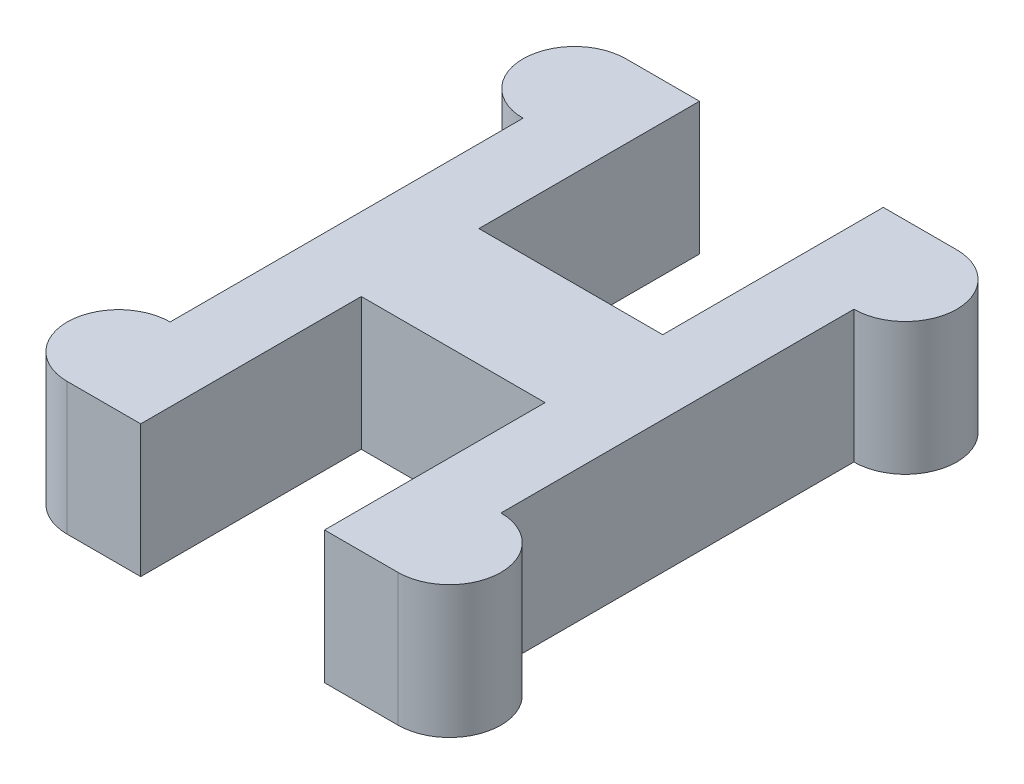
ISO-10303-21;
HEADER;
FILE_DESCRIPTION(('STEP AP214'),'2;1');
FILE_NAME('part.step','',(''),(''),'','','');
FILE_SCHEMA(('AUTOMOTIVE_DESIGN { 1 0 10303 214 1 1 1 1 }'));
ENDSEC;
DATA;
#1=APPLICATION_CONTEXT('core data for automotive mechanical design processes');
#2=APPLICATION_PROTOCOL_DEFINITION('international standard','automotive_design',2000,#1);
#3=PRODUCT_CONTEXT('',#1,'mechanical');
#4=PRODUCT('Part','Part','',(#3));
#5=PRODUCT_RELATED_PRODUCT_CATEGORY('part','',(#4));
#6=PRODUCT_DEFINITION_FORMATION('','',#4);
#7=PRODUCT_DEFINITION_CONTEXT('part definition',#1,'design');
#8=PRODUCT_DEFINITION('design','',#6,#7);
#9=PRODUCT_DEFINITION_SHAPE('','',#8);
#10=(LENGTH_UNIT() NAMED_UNIT(*) SI_UNIT(.MILLI.,.METRE.));
#11=(NAMED_UNIT(*) PLANE_ANGLE_UNIT() SI_UNIT($,.RADIAN.));
#12=(NAMED_UNIT(*) SI_UNIT($,.STERADIAN.) SOLID_ANGLE_UNIT());
#13=UNCERTAINTY_MEASURE_WITH_UNIT(LENGTH_MEASURE(1.E-05),#10,'distance_accuracy_value','');
#14=(GEOMETRIC_REPRESENTATION_CONTEXT(3) GLOBAL_UNCERTAINTY_ASSIGNED_CONTEXT((#13)) GLOBAL_UNIT_ASSIGNED_CONTEXT((#10,
#11,#12)) REPRESENTATION_CONTEXT('',''));
#15=CARTESIAN_POINT('',(0.,0.,0.));
#16=DIRECTION('',(0.,0.,1.));
#17=DIRECTION('',(1.,0.,0.));
#18=AXIS2_PLACEMENT_3D('',#15,#16,#17);
#19=CARTESIAN_POINT('',(-2.25,1.8,0.));
#20=DIRECTION('',(-1.,0.,0.));
#21=DIRECTION('',(0.,0.,1.));
#22=AXIS2_PLACEMENT_3D('',#19,#20,#21);
#23=PLANE('',#22);
#24=DIRECTION('',(0.,0.,-1.));
#25=VECTOR('',#24,1.);
#26=CARTESIAN_POINT('',(-2.25,0.,0.));
#27=LINE('',#26,#25);
#28=CARTESIAN_POINT('',(-2.25,0.,2.4));
#29=VERTEX_POINT('',#28);
#30=CARTESIAN_POINT('',(-2.25,0.,-2.4));
#31=VERTEX_POINT('',#30);
#32=EDGE_CURVE('E182',#29,#31,#27,.T.);
#33=ORIENTED_EDGE('',*,*,#32,.F.);
#34=DIRECTION('',(0.,-1.,0.));
#35=VECTOR('',#34,1.);
#36=CARTESIAN_POINT('',(-2.25,1.8,2.4));
#37=LINE('',#36,#35);
#38=CARTESIAN_POINT('',(-2.25,1.8,2.4));
#39=VERTEX_POINT('',#38);
#40=EDGE_CURVE('E11',#39,#29,#37,.T.);
#41=ORIENTED_EDGE('',*,*,#40,.F.);
#42=DIRECTION('',(0.,0.,-1.));
#43=VECTOR('',#42,1.);
#44=CARTESIAN_POINT('',(-2.25,1.8,0.));
#45=LINE('',#44,#43);
#46=CARTESIAN_POINT('',(-2.25,1.8,-2.4));
#47=VERTEX_POINT('',#46);
#48=EDGE_CURVE('E221',#39,#47,#45,.T.);
#49=ORIENTED_EDGE('',*,*,#48,.T.);
#50=DIRECTION('',(0.,-1.,0.));
#51=VECTOR('',#50,1.);
#52=CARTESIAN_POINT('',(-2.25,1.8,-2.4));
#53=LINE('',#52,#51);
#54=EDGE_CURVE('E115',#47,#31,#53,.T.);
#55=ORIENTED_EDGE('',*,*,#54,.T.);
#56=EDGE_LOOP('',(#33,#41,#49,#55));
#57=FACE_BOUND('',#56,.T.);
#58=ADVANCED_FACE('F41',(#57),#23,.T.);
#59=CARTESIAN_POINT('',(-2.25,1.8,3.1));
#60=DIRECTION('',(0.,-1.,0.));
#61=DIRECTION('',(0.,0.,-1.));
#62=AXIS2_PLACEMENT_3D('',#59,#60,#61);
#63=CYLINDRICAL_SURFACE('',#62,0.7);
#64=CARTESIAN_POINT('',(-2.25,0.,3.1));
#65=DIRECTION('',(0.,1.,0.));
#66=DIRECTION('',(0.,0.,1.));
#67=AXIS2_PLACEMENT_3D('',#64,#65,#66);
#68=CIRCLE('',#67,0.7);
#69=CARTESIAN_POINT('',(-2.25,0.,3.8));
#70=VERTEX_POINT('',#69);
#71=EDGE_CURVE('E185',#29,#70,#68,.T.);
#72=ORIENTED_EDGE('',*,*,#71,.T.);
#73=DIRECTION('',(0.,-1.,0.));
#74=VECTOR('',#73,1.);
#75=CARTESIAN_POINT('',(-2.25,1.8,3.8));
#76=LINE('',#75,#74);
#77=CARTESIAN_POINT('',(-2.25,1.8,3.8));
#78=VERTEX_POINT('',#77);
#79=EDGE_CURVE('E49',#78,#70,#76,.T.);
#80=ORIENTED_EDGE('',*,*,#79,.F.);
#81=CARTESIAN_POINT('',(-2.25,1.8,3.1));
#82=DIRECTION('',(0.,1.,0.));
#83=DIRECTION('',(0.,0.,1.));
#84=AXIS2_PLACEMENT_3D('',#81,#82,#83);
#85=CIRCLE('',#84,0.7);
#86=EDGE_CURVE('E273',#39,#78,#85,.T.);
#87=ORIENTED_EDGE('',*,*,#86,.F.);
#88=ORIENTED_EDGE('',*,*,#40,.T.);
#89=EDGE_LOOP('',(#72,#80,#87,#88));
#90=FACE_BOUND('',#89,.T.);
#91=ADVANCED_FACE('F298',(#90),#63,.T.);
#92=CARTESIAN_POINT('',(0.,1.8,3.8));
#93=DIRECTION('',(0.,0.,-1.));
#94=DIRECTION('',(-1.,0.,0.));
#95=AXIS2_PLACEMENT_3D('',#92,#93,#94);
#96=PLANE('',#95);
#97=DIRECTION('',(1.,0.,0.));
#98=VECTOR('',#97,1.);
#99=CARTESIAN_POINT('',(0.,0.,3.8));
#100=LINE('',#99,#98);
#101=CARTESIAN_POINT('',(-1.25,0.,3.8));
#102=VERTEX_POINT('',#101);
#103=EDGE_CURVE('E187',#70,#102,#100,.T.);
#104=ORIENTED_EDGE('',*,*,#103,.T.);
#105=DIRECTION('',(0.,-1.,0.));
#106=VECTOR('',#105,1.);
#107=CARTESIAN_POINT('',(-1.25,1.8,3.8));
#108=LINE('',#107,#106);
#109=CARTESIAN_POINT('',(-1.25,1.8,3.8));
#110=VERTEX_POINT('',#109);
#111=EDGE_CURVE('E246',#110,#102,#108,.T.);
#112=ORIENTED_EDGE('',*,*,#111,.F.);
#113=DIRECTION('',(1.,0.,0.));
#114=VECTOR('',#113,1.);
#115=CARTESIAN_POINT('',(0.,1.8,3.8));
#116=LINE('',#115,#114);
#117=EDGE_CURVE('E255',#78,#110,#116,.T.);
#118=ORIENTED_EDGE('',*,*,#117,.F.);
#119=ORIENTED_EDGE('',*,*,#79,.T.);
#120=EDGE_LOOP('',(#104,#112,#118,#119));
#121=FACE_BOUND('',#120,.T.);
#122=ADVANCED_FACE('F253',(#121),#96,.F.);
#123=CARTESIAN_POINT('',(-1.25,1.8,0.));
#124=DIRECTION('',(-1.,0.,0.));
#125=DIRECTION('',(0.,0.,1.));
#126=AXIS2_PLACEMENT_3D('',#123,#124,#125);
#127=PLANE('',#126);
#128=DIRECTION('',(0.,0.,-1.));
#129=VECTOR('',#128,1.);
#130=CARTESIAN_POINT('',(-1.25,0.,0.));
#131=LINE('',#130,#129);
#132=CARTESIAN_POINT('',(-1.25,0.,0.8));
#133=VERTEX_POINT('',#132);
#134=EDGE_CURVE('E189',#102,#133,#131,.T.);
#135=ORIENTED_EDGE('',*,*,#134,.T.);
#136=DIRECTION('',(0.,-1.,0.));
#137=VECTOR('',#136,1.);
#138=CARTESIAN_POINT('',(-1.25,1.8,0.8));
#139=LINE('',#138,#137);
#140=CARTESIAN_POINT('',(-1.25,1.8,0.8));
#141=VERTEX_POINT('',#140);
#142=EDGE_CURVE('E244',#141,#133,#139,.T.);
#143=ORIENTED_EDGE('',*,*,#142,.F.);
#144=DIRECTION('',(0.,0.,-1.));
#145=VECTOR('',#144,1.);
#146=CARTESIAN_POINT('',(-1.25,1.8,0.));
#147=LINE('',#146,#145);
#148=EDGE_CURVE('E267',#110,#141,#147,.T.);
#149=ORIENTED_EDGE('',*,*,#148,.F.);
#150=ORIENTED_EDGE('',*,*,#111,.T.);
#151=EDGE_LOOP('',(#135,#143,#149,#150));
#152=FACE_BOUND('',#151,.T.);
#153=ADVANCED_FACE('F264',(#152),#127,.F.);
#154=CARTESIAN_POINT('',(0.,1.8,0.8));
#155=DIRECTION('',(0.,0.,1.));
#156=DIRECTION('',(1.,0.,0.));
#157=AXIS2_PLACEMENT_3D('',#154,#155,#156);
#158=PLANE('',#157);
#159=DIRECTION('',(-1.,0.,0.));
#160=VECTOR('',#159,1.);
#161=CARTESIAN_POINT('',(0.,0.,0.8));
#162=LINE('',#161,#160);
#163=CARTESIAN_POINT('',(1.25,0.,0.8));
#164=VERTEX_POINT('',#163);
#165=EDGE_CURVE('E192',#164,#133,#162,.T.);
#166=ORIENTED_EDGE('',*,*,#165,.F.);
#167=DIRECTION('',(0.,-1.,0.));
#168=VECTOR('',#167,1.);
#169=CARTESIAN_POINT('',(1.25,1.8,0.8));
#170=LINE('',#169,#168);
#171=CARTESIAN_POINT('',(1.25,1.8,0.8));
#172=VERTEX_POINT('',#171);
#173=EDGE_CURVE('E242',#172,#164,#170,.T.);
#174=ORIENTED_EDGE('',*,*,#173,.F.);
#175=DIRECTION('',(-1.,0.,0.));
#176=VECTOR('',#175,1.);
#177=CARTESIAN_POINT('',(0.,1.8,0.8));
#178=LINE('',#177,#176);
#179=EDGE_CURVE('E269',#172,#141,#178,.T.);
#180=ORIENTED_EDGE('',*,*,#179,.T.);
#181=ORIENTED_EDGE('',*,*,#142,.T.);
#182=EDGE_LOOP('',(#166,#174,#180,#181));
#183=FACE_BOUND('',#182,.T.);
#184=ADVANCED_FACE('F308',(#183),#158,.T.);
#185=CARTESIAN_POINT('',(1.25,1.8,0.));
#186=DIRECTION('',(-1.,0.,0.));
#187=DIRECTION('',(0.,0.,1.));
#188=AXIS2_PLACEMENT_3D('',#185,#186,#187);
#189=PLANE('',#188);
#190=DIRECTION('',(0.,0.,-1.));
#191=VECTOR('',#190,1.);
#192=CARTESIAN_POINT('',(1.25,0.,0.));
#193=LINE('',#192,#191);
#194=CARTESIAN_POINT('',(1.25,0.,3.8));
#195=VERTEX_POINT('',#194);
#196=EDGE_CURVE('E195',#195,#164,#193,.T.);
#197=ORIENTED_EDGE('',*,*,#196,.F.);
#198=DIRECTION('',(0.,-1.,0.));
#199=VECTOR('',#198,1.);
#200=CARTESIAN_POINT('',(1.25,1.8,3.8));
#201=LINE('',#200,#199);
#202=CARTESIAN_POINT('',(1.25,1.8,3.8));
#203=VERTEX_POINT('',#202);
#204=EDGE_CURVE('E240',#203,#195,#201,.T.);
#205=ORIENTED_EDGE('',*,*,#204,.F.);
#206=DIRECTION('',(0.,0.,-1.));
#207=VECTOR('',#206,1.);
#208=CARTESIAN_POINT('',(1.25,1.8,0.));
#209=LINE('',#208,#207);
#210=EDGE_CURVE('E271',#203,#172,#209,.T.);
#211=ORIENTED_EDGE('',*,*,#210,.T.);
#212=ORIENTED_EDGE('',*,*,#173,.T.);
#213=EDGE_LOOP('',(#197,#205,#211,#212));
#214=FACE_BOUND('',#213,.T.);
#215=ADVANCED_FACE('F311',(#214),#189,.T.);
#216=CARTESIAN_POINT('',(0.,1.8,3.8));
#217=DIRECTION('',(0.,0.,-1.));
#218=DIRECTION('',(-1.,0.,0.));
#219=AXIS2_PLACEMENT_3D('',#216,#217,#218);
#220=PLANE('',#219);
#221=DIRECTION('',(1.,0.,0.));
#222=VECTOR('',#221,1.);
#223=CARTESIAN_POINT('',(0.,0.,3.8));
#224=LINE('',#223,#222);
#225=CARTESIAN_POINT('',(2.25,0.,3.8));
#226=VERTEX_POINT('',#225);
#227=EDGE_CURVE('E198',#195,#226,#224,.T.);
#228=ORIENTED_EDGE('',*,*,#227,.T.);
#229=DIRECTION('',(0.,-1.,0.));
#230=VECTOR('',#229,1.);
#231=CARTESIAN_POINT('',(2.25,1.8,3.8));
#232=LINE('',#231,#230);
#233=CARTESIAN_POINT('',(2.25,1.8,3.8));
#234=VERTEX_POINT('',#233);
#235=EDGE_CURVE('E237',#234,#226,#232,.T.);
#236=ORIENTED_EDGE('',*,*,#235,.F.);
#237=DIRECTION('',(1.,0.,0.));
#238=VECTOR('',#237,1.);
#239=CARTESIAN_POINT('',(0.,1.8,3.8));
#240=LINE('',#239,#238);
#241=EDGE_CURVE('E279',#203,#234,#240,.T.);
#242=ORIENTED_EDGE('',*,*,#241,.F.);
#243=ORIENTED_EDGE('',*,*,#204,.T.);
#244=EDGE_LOOP('',(#228,#236,#242,#243));
#245=FACE_BOUND('',#244,.T.);
#246=ADVANCED_FACE('F315',(#245),#220,.F.);
#247=CARTESIAN_POINT('',(2.25,1.8,3.1));
#248=DIRECTION('',(0.,-1.,0.));
#249=DIRECTION('',(0.,0.,-1.));
#250=AXIS2_PLACEMENT_3D('',#247,#248,#249);
#251=CYLINDRICAL_SURFACE('',#250,0.7);
#252=CARTESIAN_POINT('',(2.25,0.,3.1));
#253=DIRECTION('',(0.,1.,0.));
#254=DIRECTION('',(0.,0.,1.));
#255=AXIS2_PLACEMENT_3D('',#252,#253,#254);
#256=CIRCLE('',#255,0.7);
#257=CARTESIAN_POINT('',(2.25,0.,2.4));
#258=VERTEX_POINT('',#257);
#259=EDGE_CURVE('E200',#226,#258,#256,.T.);
#260=ORIENTED_EDGE('',*,*,#259,.T.);
#261=DIRECTION('',(0.,-1.,0.));
#262=VECTOR('',#261,1.);
#263=CARTESIAN_POINT('',(2.25,1.8,2.4));
#264=LINE('',#263,#262);
#265=CARTESIAN_POINT('',(2.25,1.8,2.4));
#266=VERTEX_POINT('',#265);
#267=EDGE_CURVE('E234',#266,#258,#264,.T.);
#268=ORIENTED_EDGE('',*,*,#267,.F.);
#269=CARTESIAN_POINT('',(2.25,1.8,3.1));
#270=DIRECTION('',(0.,1.,0.));
#271=DIRECTION('',(0.,0.,1.));
#272=AXIS2_PLACEMENT_3D('',#269,#270,#271);
#273=CIRCLE('',#272,0.7);
#274=EDGE_CURVE('E281',#234,#266,#273,.T.);
#275=ORIENTED_EDGE('',*,*,#274,.F.);
#276=ORIENTED_EDGE('',*,*,#235,.T.);
#277=EDGE_LOOP('',(#260,#268,#275,#276));
#278=FACE_BOUND('',#277,.T.);
#279=ADVANCED_FACE('F319',(#278),#251,.T.);
#280=CARTESIAN_POINT('',(2.25,1.8,0.));
#281=DIRECTION('',(-1.,0.,0.));
#282=DIRECTION('',(0.,0.,1.));
#283=AXIS2_PLACEMENT_3D('',#280,#281,#282);
#284=PLANE('',#283);
#285=DIRECTION('',(0.,0.,-1.));
#286=VECTOR('',#285,1.);
#287=CARTESIAN_POINT('',(2.25,0.,0.));
#288=LINE('',#287,#286);
#289=CARTESIAN_POINT('',(2.25,0.,-2.4));
#290=VERTEX_POINT('',#289);
#291=EDGE_CURVE('E202',#258,#290,#288,.T.);
#292=ORIENTED_EDGE('',*,*,#291,.T.);
#293=DIRECTION('',(0.,-1.,0.));
#294=VECTOR('',#293,1.);
#295=CARTESIAN_POINT('',(2.25,1.8,-2.4));
#296=LINE('',#295,#294);
#297=CARTESIAN_POINT('',(2.25,1.8,-2.4));
#298=VERTEX_POINT('',#297);
#299=EDGE_CURVE('E231',#298,#290,#296,.T.);
#300=ORIENTED_EDGE('',*,*,#299,.F.);
#301=DIRECTION('',(0.,0.,-1.));
#302=VECTOR('',#301,1.);
#303=CARTESIAN_POINT('',(2.25,1.8,0.));
#304=LINE('',#303,#302);
#305=EDGE_CURVE('E283',#266,#298,#304,.T.);
#306=ORIENTED_EDGE('',*,*,#305,.F.);
#307=ORIENTED_EDGE('',*,*,#267,.T.);
#308=EDGE_LOOP('',(#292,#300,#306,#307));
#309=FACE_BOUND('',#308,.T.);
#310=ADVANCED_FACE('F323',(#309),#284,.F.);
#311=CARTESIAN_POINT('',(2.25,1.8,-3.1));
#312=DIRECTION('',(0.,-1.,0.));
#313=DIRECTION('',(0.,0.,-1.));
#314=AXIS2_PLACEMENT_3D('',#311,#312,#313);
#315=CYLINDRICAL_SURFACE('',#314,0.7);
#316=CARTESIAN_POINT('',(2.25,0.,-3.1));
#317=DIRECTION('',(0.,1.,0.));
#318=DIRECTION('',(0.,0.,1.));
#319=AXIS2_PLACEMENT_3D('',#316,#317,#318);
#320=CIRCLE('',#319,0.7);
#321=CARTESIAN_POINT('',(2.25,0.,-3.8));
#322=VERTEX_POINT('',#321);
#323=EDGE_CURVE('E204',#290,#322,#320,.T.);
#324=ORIENTED_EDGE('',*,*,#323,.T.);
#325=DIRECTION('',(0.,-1.,0.));
#326=VECTOR('',#325,1.);
#327=CARTESIAN_POINT('',(2.25,1.8,-3.8));
#328=LINE('',#327,#326);
#329=CARTESIAN_POINT('',(2.25,1.8,-3.8));
#330=VERTEX_POINT('',#329);
#331=EDGE_CURVE('E229',#330,#322,#328,.T.);
#332=ORIENTED_EDGE('',*,*,#331,.F.);
#333=CARTESIAN_POINT('',(2.25,1.8,-3.1));
#334=DIRECTION('',(0.,1.,0.));
#335=DIRECTION('',(0.,0.,1.));
#336=AXIS2_PLACEMENT_3D('',#333,#334,#335);
#337=CIRCLE('',#336,0.7);
#338=EDGE_CURVE('E285',#298,#330,#337,.T.);
#339=ORIENTED_EDGE('',*,*,#338,.F.);
#340=ORIENTED_EDGE('',*,*,#299,.T.);
#341=EDGE_LOOP('',(#324,#332,#339,#340));
#342=FACE_BOUND('',#341,.T.);
#343=ADVANCED_FACE('F327',(#342),#315,.T.);
#344=CARTESIAN_POINT('',(0.,1.8,-3.8));
#345=DIRECTION('',(0.,0.,-1.));
#346=DIRECTION('',(-1.,0.,0.));
#347=AXIS2_PLACEMENT_3D('',#344,#345,#346);
#348=PLANE('',#347);
#349=DIRECTION('',(1.,0.,0.));
#350=VECTOR('',#349,1.);
#351=CARTESIAN_POINT('',(0.,0.,-3.8));
#352=LINE('',#351,#350);
#353=CARTESIAN_POINT('',(1.25,0.,-3.8));
#354=VERTEX_POINT('',#353);
#355=EDGE_CURVE('E207',#354,#322,#352,.T.);
#356=ORIENTED_EDGE('',*,*,#355,.F.);
#357=DIRECTION('',(0.,-1.,0.));
#358=VECTOR('',#357,1.);
#359=CARTESIAN_POINT('',(1.25,1.8,-3.8));
#360=LINE('',#359,#358);
#361=CARTESIAN_POINT('',(1.25,1.8,-3.8));
#362=VERTEX_POINT('',#361);
#363=EDGE_CURVE('E227',#362,#354,#360,.T.);
#364=ORIENTED_EDGE('',*,*,#363,.F.);
#365=DIRECTION('',(1.,0.,0.));
#366=VECTOR('',#365,1.);
#367=CARTESIAN_POINT('',(0.,1.8,-3.8));
#368=LINE('',#367,#366);
#369=EDGE_CURVE('E287',#362,#330,#368,.T.);
#370=ORIENTED_EDGE('',*,*,#369,.T.);
#371=ORIENTED_EDGE('',*,*,#331,.T.);
#372=EDGE_LOOP('',(#356,#364,#370,#371));
#373=FACE_BOUND('',#372,.T.);
#374=ADVANCED_FACE('F331',(#373),#348,.T.);
#375=CARTESIAN_POINT('',(1.25,1.8,0.));
#376=DIRECTION('',(1.,0.,0.));
#377=DIRECTION('',(0.,0.,-1.));
#378=AXIS2_PLACEMENT_3D('',#375,#376,#377);
#379=PLANE('',#378);
#380=DIRECTION('',(0.,0.,1.));
#381=VECTOR('',#380,1.);
#382=CARTESIAN_POINT('',(1.25,0.,0.));
#383=LINE('',#382,#381);
#384=CARTESIAN_POINT('',(1.25,0.,-0.799999999999999));
#385=VERTEX_POINT('',#384);
#386=EDGE_CURVE('E210',#354,#385,#383,.T.);
#387=ORIENTED_EDGE('',*,*,#386,.T.);
#388=DIRECTION('',(0.,-1.,0.));
#389=VECTOR('',#388,1.);
#390=CARTESIAN_POINT('',(1.25,1.8,-0.799999999999999));
#391=LINE('',#390,#389);
#392=CARTESIAN_POINT('',(1.25,1.8,-0.799999999999999));
#393=VERTEX_POINT('',#392);
#394=EDGE_CURVE('E225',#393,#385,#391,.T.);
#395=ORIENTED_EDGE('',*,*,#394,.F.);
#396=DIRECTION('',(0.,0.,1.));
#397=VECTOR('',#396,1.);
#398=CARTESIAN_POINT('',(1.25,1.8,0.));
#399=LINE('',#398,#397);
#400=EDGE_CURVE('E290',#362,#393,#399,.T.);
#401=ORIENTED_EDGE('',*,*,#400,.F.);
#402=ORIENTED_EDGE('',*,*,#363,.T.);
#403=EDGE_LOOP('',(#387,#395,#401,#402));
#404=FACE_BOUND('',#403,.T.);
#405=ADVANCED_FACE('F335',(#404),#379,.F.);
#406=CARTESIAN_POINT('',(0.,1.8,-0.799999999999999));
#407=DIRECTION('',(0.,0.,-1.));
#408=DIRECTION('',(-1.,0.,0.));
#409=AXIS2_PLACEMENT_3D('',#406,#407,#408);
#410=PLANE('',#409);
#411=DIRECTION('',(1.,0.,0.));
#412=VECTOR('',#411,1.);
#413=CARTESIAN_POINT('',(0.,0.,-0.799999999999999));
#414=LINE('',#413,#412);
#415=CARTESIAN_POINT('',(-1.25,0.,-0.799999999999999));
#416=VERTEX_POINT('',#415);
#417=EDGE_CURVE('E213',#416,#385,#414,.T.);
#418=ORIENTED_EDGE('',*,*,#417,.F.);
#419=DIRECTION('',(0.,-1.,0.));
#420=VECTOR('',#419,1.);
#421=CARTESIAN_POINT('',(-1.25,1.8,-0.799999999999999));
#422=LINE('',#421,#420);
#423=CARTESIAN_POINT('',(-1.25,1.8,-0.799999999999999));
#424=VERTEX_POINT('',#423);
#425=EDGE_CURVE('E169',#424,#416,#422,.T.);
#426=ORIENTED_EDGE('',*,*,#425,.F.);
#427=DIRECTION('',(1.,0.,0.));
#428=VECTOR('',#427,1.);
#429=CARTESIAN_POINT('',(0.,1.8,-0.799999999999999));
#430=LINE('',#429,#428);
#431=EDGE_CURVE('E175',#424,#393,#430,.T.);
#432=ORIENTED_EDGE('',*,*,#431,.T.);
#433=ORIENTED_EDGE('',*,*,#394,.T.);
#434=EDGE_LOOP('',(#418,#426,#432,#433));
#435=FACE_BOUND('',#434,.T.);
#436=ADVANCED_FACE('F293',(#435),#410,.T.);
#437=CARTESIAN_POINT('',(-1.25,1.8,0.));
#438=DIRECTION('',(1.,0.,0.));
#439=DIRECTION('',(0.,0.,-1.));
#440=AXIS2_PLACEMENT_3D('',#437,#438,#439);
#441=PLANE('',#440);
#442=DIRECTION('',(0.,0.,1.));
#443=VECTOR('',#442,1.);
#444=CARTESIAN_POINT('',(-1.25,0.,0.));
#445=LINE('',#444,#443);
#446=CARTESIAN_POINT('',(-1.25,0.,-3.8));
#447=VERTEX_POINT('',#446);
#448=EDGE_CURVE('E164',#447,#416,#445,.T.);
#449=ORIENTED_EDGE('',*,*,#448,.F.);
#450=DIRECTION('',(0.,-1.,0.));
#451=VECTOR('',#450,1.);
#452=CARTESIAN_POINT('',(-1.25,1.8,-3.8));
#453=LINE('',#452,#451);
#454=CARTESIAN_POINT('',(-1.25,1.8,-3.8));
#455=VERTEX_POINT('',#454);
#456=EDGE_CURVE('E159',#455,#447,#453,.T.);
#457=ORIENTED_EDGE('',*,*,#456,.F.);
#458=DIRECTION('',(0.,0.,1.));
#459=VECTOR('',#458,1.);
#460=CARTESIAN_POINT('',(-1.25,1.8,0.));
#461=LINE('',#460,#459);
#462=EDGE_CURVE('E162',#455,#424,#461,.T.);
#463=ORIENTED_EDGE('',*,*,#462,.T.);
#464=ORIENTED_EDGE('',*,*,#425,.T.);
#465=EDGE_LOOP('',(#449,#457,#463,#464));
#466=FACE_BOUND('',#465,.T.);
#467=ADVANCED_FACE('F161',(#466),#441,.T.);
#468=CARTESIAN_POINT('',(0.,1.8,-3.8));
#469=DIRECTION('',(0.,0.,-1.));
#470=DIRECTION('',(-1.,0.,0.));
#471=AXIS2_PLACEMENT_3D('',#468,#469,#470);
#472=PLANE('',#471);
#473=DIRECTION('',(1.,0.,0.));
#474=VECTOR('',#473,1.);
#475=CARTESIAN_POINT('',(0.,0.,-3.8));
#476=LINE('',#475,#474);
#477=CARTESIAN_POINT('',(-2.25,0.,-3.8));
#478=VERTEX_POINT('',#477);
#479=EDGE_CURVE('E217',#478,#447,#476,.T.);
#480=ORIENTED_EDGE('',*,*,#479,.F.);
#481=DIRECTION('',(0.,-1.,0.));
#482=VECTOR('',#481,1.);
#483=CARTESIAN_POINT('',(-2.25,1.8,-3.8));
#484=LINE('',#483,#482);
#485=CARTESIAN_POINT('',(-2.25,1.8,-3.8));
#486=VERTEX_POINT('',#485);
#487=EDGE_CURVE('E108',#486,#478,#484,.T.);
#488=ORIENTED_EDGE('',*,*,#487,.F.);
#489=DIRECTION('',(1.,0.,0.));
#490=VECTOR('',#489,1.);
#491=CARTESIAN_POINT('',(0.,1.8,-3.8));
#492=LINE('',#491,#490);
#493=EDGE_CURVE('E173',#486,#455,#492,.T.);
#494=ORIENTED_EDGE('',*,*,#493,.T.);
#495=ORIENTED_EDGE('',*,*,#456,.T.);
#496=EDGE_LOOP('',(#480,#488,#494,#495));
#497=FACE_BOUND('',#496,.T.);
#498=ADVANCED_FACE('F177',(#497),#472,.T.);
#499=CARTESIAN_POINT('',(-2.25,1.8,-3.1));
#500=DIRECTION('',(0.,-1.,0.));
#501=DIRECTION('',(0.,0.,-1.));
#502=AXIS2_PLACEMENT_3D('',#499,#500,#501);
#503=CYLINDRICAL_SURFACE('',#502,0.7);
#504=CARTESIAN_POINT('',(-2.25,0.,-3.1));
#505=DIRECTION('',(0.,1.,0.));
#506=DIRECTION('',(0.,0.,1.));
#507=AXIS2_PLACEMENT_3D('',#504,#505,#506);
#508=CIRCLE('',#507,0.7);
#509=EDGE_CURVE('E219',#478,#31,#508,.T.);
#510=ORIENTED_EDGE('',*,*,#509,.T.);
#511=ORIENTED_EDGE('',*,*,#54,.F.);
#512=CARTESIAN_POINT('',(-2.25,1.8,-3.1));
#513=DIRECTION('',(0.,1.,0.));
#514=DIRECTION('',(0.,0.,1.));
#515=AXIS2_PLACEMENT_3D('',#512,#513,#514);
#516=CIRCLE('',#515,0.7);
#517=EDGE_CURVE('E57',#486,#47,#516,.T.);
#518=ORIENTED_EDGE('',*,*,#517,.F.);
#519=ORIENTED_EDGE('',*,*,#487,.T.);
#520=EDGE_LOOP('',(#510,#511,#518,#519));
#521=FACE_BOUND('',#520,.T.);
#522=ADVANCED_FACE('F296',(#521),#503,.T.);
#523=CARTESIAN_POINT('',(0.,1.8,0.));
#524=DIRECTION('',(0.,1.,0.));
#525=DIRECTION('',(0.,0.,1.));
#526=AXIS2_PLACEMENT_3D('',#523,#524,#525);
#527=PLANE('',#526);
#528=ORIENTED_EDGE('',*,*,#48,.F.);
#529=ORIENTED_EDGE('',*,*,#86,.T.);
#530=ORIENTED_EDGE('',*,*,#117,.T.);
#531=ORIENTED_EDGE('',*,*,#148,.T.);
#532=ORIENTED_EDGE('',*,*,#179,.F.);
#533=ORIENTED_EDGE('',*,*,#210,.F.);
#534=ORIENTED_EDGE('',*,*,#241,.T.);
#535=ORIENTED_EDGE('',*,*,#274,.T.);
#536=ORIENTED_EDGE('',*,*,#305,.T.);
#537=ORIENTED_EDGE('',*,*,#338,.T.);
#538=ORIENTED_EDGE('',*,*,#369,.F.);
#539=ORIENTED_EDGE('',*,*,#400,.T.);
#540=ORIENTED_EDGE('',*,*,#431,.F.);
#541=ORIENTED_EDGE('',*,*,#462,.F.);
#542=ORIENTED_EDGE('',*,*,#493,.F.);
#543=ORIENTED_EDGE('',*,*,#517,.T.);
#544=EDGE_LOOP('',(#528,#529,#530,#531,#532,#533,#534,#535,#536,#537,#538,#539,#540,#541,#542,#543));
#545=FACE_BOUND('',#544,.T.);
#546=ADVANCED_FACE('F172',(#545),#527,.T.);
#547=CARTESIAN_POINT('',(0.,0.,0.));
#548=DIRECTION('',(0.,1.,0.));
#549=DIRECTION('',(0.,0.,1.));
#550=AXIS2_PLACEMENT_3D('',#547,#548,#549);
#551=PLANE('',#550);
#552=ORIENTED_EDGE('',*,*,#32,.T.);
#553=ORIENTED_EDGE('',*,*,#509,.F.);
#554=ORIENTED_EDGE('',*,*,#479,.T.);
#555=ORIENTED_EDGE('',*,*,#448,.T.);
#556=ORIENTED_EDGE('',*,*,#417,.T.);
#557=ORIENTED_EDGE('',*,*,#386,.F.);
#558=ORIENTED_EDGE('',*,*,#355,.T.);
#559=ORIENTED_EDGE('',*,*,#323,.F.);
#560=ORIENTED_EDGE('',*,*,#291,.F.);
#561=ORIENTED_EDGE('',*,*,#259,.F.);
#562=ORIENTED_EDGE('',*,*,#227,.F.);
#563=ORIENTED_EDGE('',*,*,#196,.T.);
#564=ORIENTED_EDGE('',*,*,#165,.T.);
#565=ORIENTED_EDGE('',*,*,#134,.F.);
#566=ORIENTED_EDGE('',*,*,#103,.F.);
#567=ORIENTED_EDGE('',*,*,#71,.F.);
#568=EDGE_LOOP('',(#552,#553,#554,#555,#556,#557,#558,#559,#560,#561,#562,#563,#564,#565,#566,#567));
#569=FACE_BOUND('',#568,.T.);
#570=ADVANCED_FACE('F260',(#569),#551,.F.);
#571=CLOSED_SHELL('',(#58,#91,#122,#153,#184,#215,#246,#279,#310,#343,#374,#405,#436,#467,#498,
#522,#546,#570));
#572=MANIFOLD_SOLID_BREP('B2',#571);
#573=ADVANCED_BREP_SHAPE_REPRESENTATION('',(#18,#572),#14);
#574=SHAPE_DEFINITION_REPRESENTATION(#9,#573);
ENDSEC;
END-ISO-10303-21;
